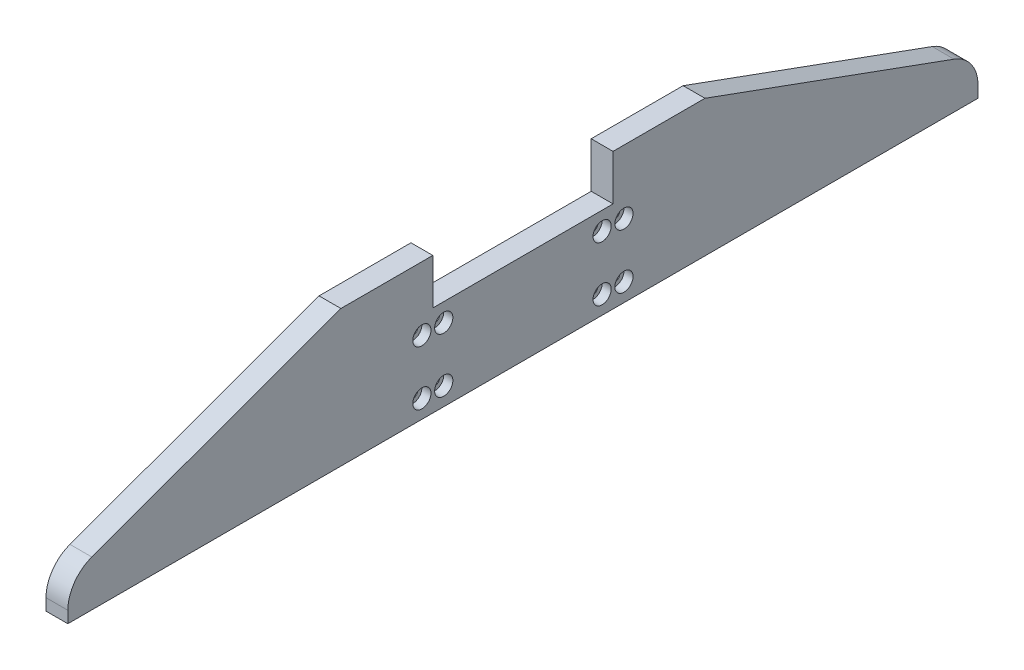
ISO-10303-21;
HEADER;
FILE_DESCRIPTION(('STEP AP214'),'2;1');
FILE_NAME('part.step','',(''),(''),'','','');
FILE_SCHEMA(('AUTOMOTIVE_DESIGN { 1 0 10303 214 1 1 1 1 }'));
ENDSEC;
DATA;
#1=APPLICATION_CONTEXT('core data for automotive mechanical design processes');
#2=APPLICATION_PROTOCOL_DEFINITION('international standard','automotive_design',2000,#1);
#3=PRODUCT_CONTEXT('',#1,'mechanical');
#4=PRODUCT('Part','Part','',(#3));
#5=PRODUCT_RELATED_PRODUCT_CATEGORY('part','',(#4));
#6=PRODUCT_DEFINITION_FORMATION('','',#4);
#7=PRODUCT_DEFINITION_CONTEXT('part definition',#1,'design');
#8=PRODUCT_DEFINITION('design','',#6,#7);
#9=PRODUCT_DEFINITION_SHAPE('','',#8);
#10=(LENGTH_UNIT() NAMED_UNIT(*) SI_UNIT(.MILLI.,.METRE.));
#11=(NAMED_UNIT(*) PLANE_ANGLE_UNIT() SI_UNIT($,.RADIAN.));
#12=(NAMED_UNIT(*) SI_UNIT($,.STERADIAN.) SOLID_ANGLE_UNIT());
#13=UNCERTAINTY_MEASURE_WITH_UNIT(LENGTH_MEASURE(1.E-05),#10,'distance_accuracy_value','');
#14=(GEOMETRIC_REPRESENTATION_CONTEXT(3) GLOBAL_UNCERTAINTY_ASSIGNED_CONTEXT((#13)) GLOBAL_UNIT_ASSIGNED_CONTEXT((#10,
#11,#12)) REPRESENTATION_CONTEXT('',''));
#15=CARTESIAN_POINT('',(0.,0.,0.));
#16=DIRECTION('',(0.,0.,1.));
#17=DIRECTION('',(1.,0.,0.));
#18=AXIS2_PLACEMENT_3D('',#15,#16,#17);
#19=CARTESIAN_POINT('',(12.,0.,500.));
#20=DIRECTION('',(-1.,0.,0.));
#21=DIRECTION('',(0.,-1.,0.));
#22=AXIS2_PLACEMENT_3D('',#19,#20,#21);
#23=PLANE('',#22);
#24=CARTESIAN_POINT('',(12.,40.,194.5));
#25=DIRECTION('',(1.,0.,0.));
#26=DIRECTION('',(0.,0.,-1.));
#27=AXIS2_PLACEMENT_3D('',#24,#25,#26);
#28=CIRCLE('',#27,5.);
#29=CARTESIAN_POINT('',(12.,40.,189.5));
#30=VERTEX_POINT('',#29);
#31=EDGE_CURVE('E559',#30,#30,#28,.T.);
#32=ORIENTED_EDGE('',*,*,#31,.F.);
#33=EDGE_LOOP('',(#32));
#34=FACE_BOUND('',#33,.T.);
#35=CARTESIAN_POINT('',(12.,40.,305.5));
#36=DIRECTION('',(1.,0.,0.));
#37=DIRECTION('',(0.,0.,-1.));
#38=AXIS2_PLACEMENT_3D('',#35,#36,#37);
#39=CIRCLE('',#38,5.);
#40=CARTESIAN_POINT('',(12.,40.,300.5));
#41=VERTEX_POINT('',#40);
#42=EDGE_CURVE('E581',#41,#41,#39,.T.);
#43=ORIENTED_EDGE('',*,*,#42,.F.);
#44=EDGE_LOOP('',(#43));
#45=FACE_BOUND('',#44,.T.);
#46=CARTESIAN_POINT('',(12.,9.99999999999999,305.5));
#47=DIRECTION('',(1.,0.,0.));
#48=DIRECTION('',(0.,0.,-1.));
#49=AXIS2_PLACEMENT_3D('',#46,#47,#48);
#50=CIRCLE('',#49,5.);
#51=CARTESIAN_POINT('',(12.,9.99999999999999,300.5));
#52=VERTEX_POINT('',#51);
#53=EDGE_CURVE('E593',#52,#52,#50,.T.);
#54=ORIENTED_EDGE('',*,*,#53,.F.);
#55=EDGE_LOOP('',(#54));
#56=FACE_BOUND('',#55,.T.);
#57=CARTESIAN_POINT('',(12.,40.,293.5));
#58=DIRECTION('',(1.,0.,0.));
#59=DIRECTION('',(0.,0.,-1.));
#60=AXIS2_PLACEMENT_3D('',#57,#58,#59);
#61=CIRCLE('',#60,5.);
#62=CARTESIAN_POINT('',(12.,40.,288.5));
#63=VERTEX_POINT('',#62);
#64=EDGE_CURVE('E605',#63,#63,#61,.T.);
#65=ORIENTED_EDGE('',*,*,#64,.F.);
#66=EDGE_LOOP('',(#65));
#67=FACE_BOUND('',#66,.T.);
#68=CARTESIAN_POINT('',(12.,9.99999999999999,206.5));
#69=DIRECTION('',(1.,0.,0.));
#70=DIRECTION('',(0.,0.,-1.));
#71=AXIS2_PLACEMENT_3D('',#68,#69,#70);
#72=CIRCLE('',#71,5.);
#73=CARTESIAN_POINT('',(12.,9.99999999999999,201.5));
#74=VERTEX_POINT('',#73);
#75=EDGE_CURVE('E617',#74,#74,#72,.T.);
#76=ORIENTED_EDGE('',*,*,#75,.F.);
#77=EDGE_LOOP('',(#76));
#78=FACE_BOUND('',#77,.T.);
#79=CARTESIAN_POINT('',(12.,9.99999999999999,293.5));
#80=DIRECTION('',(1.,0.,0.));
#81=DIRECTION('',(0.,0.,-1.));
#82=AXIS2_PLACEMENT_3D('',#79,#80,#81);
#83=CIRCLE('',#82,5.);
#84=CARTESIAN_POINT('',(12.,9.99999999999999,288.5));
#85=VERTEX_POINT('',#84);
#86=EDGE_CURVE('E629',#85,#85,#83,.T.);
#87=ORIENTED_EDGE('',*,*,#86,.F.);
#88=EDGE_LOOP('',(#87));
#89=FACE_BOUND('',#88,.T.);
#90=CARTESIAN_POINT('',(12.,40.,206.5));
#91=DIRECTION('',(1.,0.,0.));
#92=DIRECTION('',(0.,0.,-1.));
#93=AXIS2_PLACEMENT_3D('',#90,#91,#92);
#94=CIRCLE('',#93,5.);
#95=CARTESIAN_POINT('',(12.,40.,201.5));
#96=VERTEX_POINT('',#95);
#97=EDGE_CURVE('E641',#96,#96,#94,.T.);
#98=ORIENTED_EDGE('',*,*,#97,.F.);
#99=EDGE_LOOP('',(#98));
#100=FACE_BOUND('',#99,.T.);
#101=DIRECTION('',(0.,0.342020143325666,-0.939692620785909));
#102=VECTOR('',#101,1.);
#103=CARTESIAN_POINT('',(12.,20.4044648600696,500.));
#104=LINE('',#103,#102);
#105=CARTESIAN_POINT('',(12.,75.,349.999999999999));
#106=VERTEX_POINT('',#105);
#107=CARTESIAN_POINT('',(12.,25.1941665115935,486.840402866513));
#108=VERTEX_POINT('',#107);
#109=EDGE_CURVE('E199',#106,#108,#104,.F.);
#110=ORIENTED_EDGE('',*,*,#109,.T.);
#111=CARTESIAN_POINT('',(12.,6.40031409587534,480.));
#112=DIRECTION('',(-1.,0.,0.));
#113=DIRECTION('',(0.,-1.,0.));
#114=AXIS2_PLACEMENT_3D('',#111,#112,#113);
#115=CIRCLE('',#114,20.);
#116=CARTESIAN_POINT('',(12.,6.40031409587534,500.));
#117=VERTEX_POINT('',#116);
#118=EDGE_CURVE('E211',#108,#117,#115,.F.);
#119=ORIENTED_EDGE('',*,*,#118,.T.);
#120=DIRECTION('',(0.,1.,0.));
#121=VECTOR('',#120,1.);
#122=CARTESIAN_POINT('',(12.,0.,500.));
#123=LINE('',#122,#121);
#124=CARTESIAN_POINT('',(12.,0.,500.));
#125=VERTEX_POINT('',#124);
#126=EDGE_CURVE('E169',#125,#117,#123,.T.);
#127=ORIENTED_EDGE('',*,*,#126,.F.);
#128=DIRECTION('',(0.,0.,-1.));
#129=VECTOR('',#128,1.);
#130=CARTESIAN_POINT('',(12.,0.,500.));
#131=LINE('',#130,#129);
#132=CARTESIAN_POINT('',(12.,0.,0.));
#133=VERTEX_POINT('',#132);
#134=EDGE_CURVE('E181',#125,#133,#131,.T.);
#135=ORIENTED_EDGE('',*,*,#134,.T.);
#136=DIRECTION('',(0.,1.,0.));
#137=VECTOR('',#136,1.);
#138=CARTESIAN_POINT('',(12.,0.,0.));
#139=LINE('',#138,#137);
#140=CARTESIAN_POINT('',(12.,6.40031409587533,0.));
#141=VERTEX_POINT('',#140);
#142=EDGE_CURVE('E167',#133,#141,#139,.T.);
#143=ORIENTED_EDGE('',*,*,#142,.T.);
#144=CARTESIAN_POINT('',(12.,6.40031409587533,20.));
#145=DIRECTION('',(-1.,0.,0.));
#146=DIRECTION('',(0.,-1.,0.));
#147=AXIS2_PLACEMENT_3D('',#144,#145,#146);
#148=CIRCLE('',#147,20.);
#149=CARTESIAN_POINT('',(12.,25.1941665115935,13.1595971334867));
#150=VERTEX_POINT('',#149);
#151=EDGE_CURVE('E48',#141,#150,#148,.F.);
#152=ORIENTED_EDGE('',*,*,#151,.T.);
#153=DIRECTION('',(0.,0.342020143325666,0.939692620785909));
#154=VECTOR('',#153,1.);
#155=CARTESIAN_POINT('',(12.,75.,150.000000000001));
#156=LINE('',#155,#154);
#157=CARTESIAN_POINT('',(12.,75.,150.000000000001));
#158=VERTEX_POINT('',#157);
#159=EDGE_CURVE('E193',#150,#158,#156,.T.);
#160=ORIENTED_EDGE('',*,*,#159,.T.);
#161=DIRECTION('',(0.,0.,-1.));
#162=VECTOR('',#161,1.);
#163=CARTESIAN_POINT('',(12.,75.,500.));
#164=LINE('',#163,#162);
#165=CARTESIAN_POINT('',(12.,75.,200.5));
#166=VERTEX_POINT('',#165);
#167=EDGE_CURVE('E144',#166,#158,#164,.T.);
#168=ORIENTED_EDGE('',*,*,#167,.F.);
#169=DIRECTION('',(0.,-1.,0.));
#170=VECTOR('',#169,1.);
#171=CARTESIAN_POINT('',(12.,75.,200.5));
#172=LINE('',#171,#170);
#173=CARTESIAN_POINT('',(12.,50.,200.5));
#174=VERTEX_POINT('',#173);
#175=EDGE_CURVE('E124',#166,#174,#172,.T.);
#176=ORIENTED_EDGE('',*,*,#175,.T.);
#177=DIRECTION('',(0.,0.,1.));
#178=VECTOR('',#177,1.);
#179=CARTESIAN_POINT('',(12.,50.,200.5));
#180=LINE('',#179,#178);
#181=CARTESIAN_POINT('',(12.,50.,299.5));
#182=VERTEX_POINT('',#181);
#183=EDGE_CURVE('E135',#174,#182,#180,.T.);
#184=ORIENTED_EDGE('',*,*,#183,.T.);
#185=DIRECTION('',(0.,1.,0.));
#186=VECTOR('',#185,1.);
#187=CARTESIAN_POINT('',(12.,75.,299.5));
#188=LINE('',#187,#186);
#189=CARTESIAN_POINT('',(12.,75.,299.5));
#190=VERTEX_POINT('',#189);
#191=EDGE_CURVE('E132',#182,#190,#188,.T.);
#192=ORIENTED_EDGE('',*,*,#191,.T.);
#193=EDGE_CURVE('E179',#106,#190,#164,.T.);
#194=ORIENTED_EDGE('',*,*,#193,.F.);
#195=EDGE_LOOP('',(#110,#119,#127,#135,#143,#152,#160,#168,#176,#184,#192,#194));
#196=FACE_BOUND('',#195,.T.);
#197=CARTESIAN_POINT('',(12.,9.99999999999999,194.5));
#198=DIRECTION('',(1.,0.,0.));
#199=DIRECTION('',(0.,0.,-1.));
#200=AXIS2_PLACEMENT_3D('',#197,#198,#199);
#201=CIRCLE('',#200,5.);
#202=CARTESIAN_POINT('',(12.,9.99999999999999,189.5));
#203=VERTEX_POINT('',#202);
#204=EDGE_CURVE('E569',#203,#203,#201,.T.);
#205=ORIENTED_EDGE('',*,*,#204,.F.);
#206=EDGE_LOOP('',(#205));
#207=FACE_BOUND('',#206,.T.);
#208=ADVANCED_FACE('F33',(#34,#45,#56,#67,#78,#89,#100,#196,#207),#23,.F.);
#209=CARTESIAN_POINT('',(0.,75.,500.));
#210=DIRECTION('',(0.,-1.,0.));
#211=DIRECTION('',(0.,0.,-1.));
#212=AXIS2_PLACEMENT_3D('',#209,#210,#211);
#213=PLANE('',#212);
#214=ORIENTED_EDGE('',*,*,#167,.T.);
#215=DIRECTION('',(-1.,0.,0.));
#216=VECTOR('',#215,1.);
#217=CARTESIAN_POINT('',(0.,75.,150.000000000001));
#218=LINE('',#217,#216);
#219=CARTESIAN_POINT('',(0.,75.,150.000000000001));
#220=VERTEX_POINT('',#219);
#221=EDGE_CURVE('E187',#158,#220,#218,.T.);
#222=ORIENTED_EDGE('',*,*,#221,.T.);
#223=DIRECTION('',(0.,0.,-1.));
#224=VECTOR('',#223,1.);
#225=CARTESIAN_POINT('',(0.,75.,500.));
#226=LINE('',#225,#224);
#227=CARTESIAN_POINT('',(0.,75.,200.5));
#228=VERTEX_POINT('',#227);
#229=EDGE_CURVE('E172',#228,#220,#226,.T.);
#230=ORIENTED_EDGE('',*,*,#229,.F.);
#231=DIRECTION('',(-1.,0.,0.));
#232=VECTOR('',#231,1.);
#233=CARTESIAN_POINT('',(12.,75.,200.5));
#234=LINE('',#233,#232);
#235=EDGE_CURVE('E157',#166,#228,#234,.T.);
#236=ORIENTED_EDGE('',*,*,#235,.F.);
#237=EDGE_LOOP('',(#214,#222,#230,#236));
#238=FACE_BOUND('',#237,.T.);
#239=ADVANCED_FACE('F232',(#238),#213,.F.);
#240=CARTESIAN_POINT('',(0.,0.,500.));
#241=DIRECTION('',(1.,0.,0.));
#242=DIRECTION('',(0.,1.,0.));
#243=AXIS2_PLACEMENT_3D('',#240,#241,#242);
#244=PLANE('',#243);
#245=CARTESIAN_POINT('',(0.,40.,194.5));
#246=DIRECTION('',(1.,0.,0.));
#247=DIRECTION('',(0.,0.,-1.));
#248=AXIS2_PLACEMENT_3D('',#245,#246,#247);
#249=CIRCLE('',#248,2.75);
#250=CARTESIAN_POINT('',(0.,40.,191.75));
#251=VERTEX_POINT('',#250);
#252=EDGE_CURVE('E566',#251,#251,#249,.T.);
#253=ORIENTED_EDGE('',*,*,#252,.T.);
#254=EDGE_LOOP('',(#253));
#255=FACE_BOUND('',#254,.T.);
#256=CARTESIAN_POINT('',(0.,9.99999999999999,194.5));
#257=DIRECTION('',(1.,0.,0.));
#258=DIRECTION('',(0.,0.,-1.));
#259=AXIS2_PLACEMENT_3D('',#256,#257,#258);
#260=CIRCLE('',#259,2.75);
#261=CARTESIAN_POINT('',(0.,9.99999999999999,191.75));
#262=VERTEX_POINT('',#261);
#263=EDGE_CURVE('E578',#262,#262,#260,.T.);
#264=ORIENTED_EDGE('',*,*,#263,.T.);
#265=EDGE_LOOP('',(#264));
#266=FACE_BOUND('',#265,.T.);
#267=CARTESIAN_POINT('',(0.,40.,305.5));
#268=DIRECTION('',(1.,0.,0.));
#269=DIRECTION('',(0.,0.,-1.));
#270=AXIS2_PLACEMENT_3D('',#267,#268,#269);
#271=CIRCLE('',#270,2.75);
#272=CARTESIAN_POINT('',(0.,40.,302.75));
#273=VERTEX_POINT('',#272);
#274=EDGE_CURVE('E590',#273,#273,#271,.T.);
#275=ORIENTED_EDGE('',*,*,#274,.T.);
#276=EDGE_LOOP('',(#275));
#277=FACE_BOUND('',#276,.T.);
#278=CARTESIAN_POINT('',(0.,9.99999999999999,305.5));
#279=DIRECTION('',(1.,0.,0.));
#280=DIRECTION('',(0.,0.,-1.));
#281=AXIS2_PLACEMENT_3D('',#278,#279,#280);
#282=CIRCLE('',#281,2.75);
#283=CARTESIAN_POINT('',(0.,9.99999999999999,302.75));
#284=VERTEX_POINT('',#283);
#285=EDGE_CURVE('E602',#284,#284,#282,.T.);
#286=ORIENTED_EDGE('',*,*,#285,.T.);
#287=EDGE_LOOP('',(#286));
#288=FACE_BOUND('',#287,.T.);
#289=CARTESIAN_POINT('',(0.,40.,293.5));
#290=DIRECTION('',(1.,0.,0.));
#291=DIRECTION('',(0.,0.,-1.));
#292=AXIS2_PLACEMENT_3D('',#289,#290,#291);
#293=CIRCLE('',#292,2.75);
#294=CARTESIAN_POINT('',(0.,40.,290.75));
#295=VERTEX_POINT('',#294);
#296=EDGE_CURVE('E614',#295,#295,#293,.T.);
#297=ORIENTED_EDGE('',*,*,#296,.T.);
#298=EDGE_LOOP('',(#297));
#299=FACE_BOUND('',#298,.T.);
#300=CARTESIAN_POINT('',(0.,9.99999999999999,206.5));
#301=DIRECTION('',(1.,0.,0.));
#302=DIRECTION('',(0.,0.,-1.));
#303=AXIS2_PLACEMENT_3D('',#300,#301,#302);
#304=CIRCLE('',#303,2.75);
#305=CARTESIAN_POINT('',(0.,9.99999999999999,203.75));
#306=VERTEX_POINT('',#305);
#307=EDGE_CURVE('E626',#306,#306,#304,.T.);
#308=ORIENTED_EDGE('',*,*,#307,.T.);
#309=EDGE_LOOP('',(#308));
#310=FACE_BOUND('',#309,.T.);
#311=CARTESIAN_POINT('',(0.,9.99999999999999,293.5));
#312=DIRECTION('',(1.,0.,0.));
#313=DIRECTION('',(0.,0.,-1.));
#314=AXIS2_PLACEMENT_3D('',#311,#312,#313);
#315=CIRCLE('',#314,2.75);
#316=CARTESIAN_POINT('',(0.,9.99999999999999,290.75));
#317=VERTEX_POINT('',#316);
#318=EDGE_CURVE('E638',#317,#317,#315,.T.);
#319=ORIENTED_EDGE('',*,*,#318,.T.);
#320=EDGE_LOOP('',(#319));
#321=FACE_BOUND('',#320,.T.);
#322=CARTESIAN_POINT('',(0.,40.,206.5));
#323=DIRECTION('',(1.,0.,0.));
#324=DIRECTION('',(0.,0.,-1.));
#325=AXIS2_PLACEMENT_3D('',#322,#323,#324);
#326=CIRCLE('',#325,2.75);
#327=CARTESIAN_POINT('',(0.,40.,203.75));
#328=VERTEX_POINT('',#327);
#329=EDGE_CURVE('E151',#328,#328,#326,.T.);
#330=ORIENTED_EDGE('',*,*,#329,.T.);
#331=EDGE_LOOP('',(#330));
#332=FACE_BOUND('',#331,.T.);
#333=DIRECTION('',(0.,-1.,0.));
#334=VECTOR('',#333,1.);
#335=CARTESIAN_POINT('',(0.,0.,500.));
#336=LINE('',#335,#334);
#337=CARTESIAN_POINT('',(0.,6.40031409587534,500.));
#338=VERTEX_POINT('',#337);
#339=CARTESIAN_POINT('',(0.,0.,500.));
#340=VERTEX_POINT('',#339);
#341=EDGE_CURVE('E164',#338,#340,#336,.T.);
#342=ORIENTED_EDGE('',*,*,#341,.F.);
#343=CARTESIAN_POINT('',(0.,6.40031409587534,480.));
#344=DIRECTION('',(1.,0.,0.));
#345=DIRECTION('',(0.,1.,0.));
#346=AXIS2_PLACEMENT_3D('',#343,#344,#345);
#347=CIRCLE('',#346,20.);
#348=CARTESIAN_POINT('',(0.,25.1941665115935,486.840402866513));
#349=VERTEX_POINT('',#348);
#350=EDGE_CURVE('E206',#338,#349,#347,.F.);
#351=ORIENTED_EDGE('',*,*,#350,.T.);
#352=DIRECTION('',(0.,-0.342020143325666,0.939692620785909));
#353=VECTOR('',#352,1.);
#354=CARTESIAN_POINT('',(0.,20.4044648600696,500.));
#355=LINE('',#354,#353);
#356=CARTESIAN_POINT('',(0.,75.,349.999999999999));
#357=VERTEX_POINT('',#356);
#358=EDGE_CURVE('E195',#349,#357,#355,.F.);
#359=ORIENTED_EDGE('',*,*,#358,.T.);
#360=CARTESIAN_POINT('',(0.,75.,299.5));
#361=VERTEX_POINT('',#360);
#362=EDGE_CURVE('E177',#357,#361,#226,.T.);
#363=ORIENTED_EDGE('',*,*,#362,.T.);
#364=DIRECTION('',(0.,1.,0.));
#365=VECTOR('',#364,1.);
#366=CARTESIAN_POINT('',(0.,75.,299.5));
#367=LINE('',#366,#365);
#368=CARTESIAN_POINT('',(0.,50.,299.5));
#369=VERTEX_POINT('',#368);
#370=EDGE_CURVE('E145',#369,#361,#367,.T.);
#371=ORIENTED_EDGE('',*,*,#370,.F.);
#372=DIRECTION('',(0.,0.,1.));
#373=VECTOR('',#372,1.);
#374=CARTESIAN_POINT('',(0.,50.,200.5));
#375=LINE('',#374,#373);
#376=CARTESIAN_POINT('',(0.,50.,200.5));
#377=VERTEX_POINT('',#376);
#378=EDGE_CURVE('E148',#377,#369,#375,.T.);
#379=ORIENTED_EDGE('',*,*,#378,.F.);
#380=DIRECTION('',(0.,-1.,0.));
#381=VECTOR('',#380,1.);
#382=CARTESIAN_POINT('',(0.,75.,200.5));
#383=LINE('',#382,#381);
#384=EDGE_CURVE('E127',#228,#377,#383,.T.);
#385=ORIENTED_EDGE('',*,*,#384,.F.);
#386=ORIENTED_EDGE('',*,*,#229,.T.);
#387=DIRECTION('',(0.,-0.342020143325666,-0.939692620785909));
#388=VECTOR('',#387,1.);
#389=CARTESIAN_POINT('',(0.,75.,150.000000000001));
#390=LINE('',#389,#388);
#391=CARTESIAN_POINT('',(0.,25.1941665115935,13.1595971334867));
#392=VERTEX_POINT('',#391);
#393=EDGE_CURVE('E190',#220,#392,#390,.T.);
#394=ORIENTED_EDGE('',*,*,#393,.T.);
#395=CARTESIAN_POINT('',(0.,6.40031409587533,20.));
#396=DIRECTION('',(1.,0.,0.));
#397=DIRECTION('',(0.,1.,0.));
#398=AXIS2_PLACEMENT_3D('',#395,#396,#397);
#399=CIRCLE('',#398,20.);
#400=CARTESIAN_POINT('',(0.,6.40031409587533,0.));
#401=VERTEX_POINT('',#400);
#402=EDGE_CURVE('E204',#392,#401,#399,.F.);
#403=ORIENTED_EDGE('',*,*,#402,.T.);
#404=DIRECTION('',(0.,-1.,0.));
#405=VECTOR('',#404,1.);
#406=CARTESIAN_POINT('',(0.,0.,0.));
#407=LINE('',#406,#405);
#408=CARTESIAN_POINT('',(0.,0.,0.));
#409=VERTEX_POINT('',#408);
#410=EDGE_CURVE('E159',#401,#409,#407,.T.);
#411=ORIENTED_EDGE('',*,*,#410,.T.);
#412=DIRECTION('',(0.,0.,-1.));
#413=VECTOR('',#412,1.);
#414=CARTESIAN_POINT('',(0.,0.,500.));
#415=LINE('',#414,#413);
#416=EDGE_CURVE('E184',#340,#409,#415,.T.);
#417=ORIENTED_EDGE('',*,*,#416,.F.);
#418=EDGE_LOOP('',(#342,#351,#359,#363,#371,#379,#385,#386,#394,#403,#411,#417));
#419=FACE_BOUND('',#418,.T.);
#420=ADVANCED_FACE('F226',(#255,#266,#277,#288,#299,#310,#321,#332,#419),#244,.F.);
#421=CARTESIAN_POINT('',(0.,0.,500.));
#422=DIRECTION('',(0.,1.,0.));
#423=DIRECTION('',(0.,0.,1.));
#424=AXIS2_PLACEMENT_3D('',#421,#422,#423);
#425=PLANE('',#424);
#426=DIRECTION('',(1.,0.,0.));
#427=VECTOR('',#426,1.);
#428=CARTESIAN_POINT('',(0.,0.,0.));
#429=LINE('',#428,#427);
#430=EDGE_CURVE('E174',#409,#133,#429,.T.);
#431=ORIENTED_EDGE('',*,*,#430,.T.);
#432=ORIENTED_EDGE('',*,*,#134,.F.);
#433=DIRECTION('',(1.,0.,0.));
#434=VECTOR('',#433,1.);
#435=CARTESIAN_POINT('',(0.,0.,500.));
#436=LINE('',#435,#434);
#437=EDGE_CURVE('E166',#340,#125,#436,.T.);
#438=ORIENTED_EDGE('',*,*,#437,.F.);
#439=ORIENTED_EDGE('',*,*,#416,.T.);
#440=EDGE_LOOP('',(#431,#432,#438,#439));
#441=FACE_BOUND('',#440,.T.);
#442=ADVANCED_FACE('F222',(#441),#425,.F.);
#443=ORIENTED_EDGE('',*,*,#362,.F.);
#444=DIRECTION('',(1.,0.,0.));
#445=VECTOR('',#444,1.);
#446=CARTESIAN_POINT('',(0.,75.,349.999999999999));
#447=LINE('',#446,#445);
#448=EDGE_CURVE('E197',#357,#106,#447,.T.);
#449=ORIENTED_EDGE('',*,*,#448,.T.);
#450=ORIENTED_EDGE('',*,*,#193,.T.);
#451=DIRECTION('',(-1.,0.,0.));
#452=VECTOR('',#451,1.);
#453=CARTESIAN_POINT('',(12.,75.,299.5));
#454=LINE('',#453,#452);
#455=EDGE_CURVE('E160',#190,#361,#454,.T.);
#456=ORIENTED_EDGE('',*,*,#455,.T.);
#457=EDGE_LOOP('',(#443,#449,#450,#456));
#458=FACE_BOUND('',#457,.T.);
#459=ADVANCED_FACE('F240',(#458),#213,.F.);
#460=CARTESIAN_POINT('',(0.,0.,500.));
#461=DIRECTION('',(0.,0.,-1.));
#462=DIRECTION('',(-1.,0.,0.));
#463=AXIS2_PLACEMENT_3D('',#460,#461,#462);
#464=PLANE('',#463);
#465=ORIENTED_EDGE('',*,*,#126,.T.);
#466=DIRECTION('',(1.,0.,0.));
#467=VECTOR('',#466,1.);
#468=CARTESIAN_POINT('',(0.,6.40031409587534,500.));
#469=LINE('',#468,#467);
#470=EDGE_CURVE('E201',#117,#338,#469,.F.);
#471=ORIENTED_EDGE('',*,*,#470,.T.);
#472=ORIENTED_EDGE('',*,*,#341,.T.);
#473=ORIENTED_EDGE('',*,*,#437,.T.);
#474=EDGE_LOOP('',(#465,#471,#472,#473));
#475=FACE_BOUND('',#474,.T.);
#476=ADVANCED_FACE('F253',(#475),#464,.F.);
#477=CARTESIAN_POINT('',(0.,0.,0.));
#478=DIRECTION('',(0.,0.,-1.));
#479=DIRECTION('',(-1.,0.,0.));
#480=AXIS2_PLACEMENT_3D('',#477,#478,#479);
#481=PLANE('',#480);
#482=ORIENTED_EDGE('',*,*,#410,.F.);
#483=DIRECTION('',(1.,0.,0.));
#484=VECTOR('',#483,1.);
#485=CARTESIAN_POINT('',(0.,6.40031409587533,0.));
#486=LINE('',#485,#484);
#487=EDGE_CURVE('E41',#401,#141,#486,.T.);
#488=ORIENTED_EDGE('',*,*,#487,.T.);
#489=ORIENTED_EDGE('',*,*,#142,.F.);
#490=ORIENTED_EDGE('',*,*,#430,.F.);
#491=EDGE_LOOP('',(#482,#488,#489,#490));
#492=FACE_BOUND('',#491,.T.);
#493=ADVANCED_FACE('F215',(#492),#481,.T.);
#494=CARTESIAN_POINT('',(12.,75.,200.5));
#495=DIRECTION('',(0.,0.,-1.));
#496=DIRECTION('',(-1.,0.,0.));
#497=AXIS2_PLACEMENT_3D('',#494,#495,#496);
#498=PLANE('',#497);
#499=ORIENTED_EDGE('',*,*,#384,.T.);
#500=DIRECTION('',(-1.,0.,0.));
#501=VECTOR('',#500,1.);
#502=CARTESIAN_POINT('',(12.,50.,200.5));
#503=LINE('',#502,#501);
#504=EDGE_CURVE('E120',#174,#377,#503,.T.);
#505=ORIENTED_EDGE('',*,*,#504,.F.);
#506=ORIENTED_EDGE('',*,*,#175,.F.);
#507=ORIENTED_EDGE('',*,*,#235,.T.);
#508=EDGE_LOOP('',(#499,#505,#506,#507));
#509=FACE_BOUND('',#508,.T.);
#510=ADVANCED_FACE('F122',(#509),#498,.F.);
#511=CARTESIAN_POINT('',(12.,75.,299.5));
#512=DIRECTION('',(0.,0.,1.));
#513=DIRECTION('',(1.,0.,0.));
#514=AXIS2_PLACEMENT_3D('',#511,#512,#513);
#515=PLANE('',#514);
#516=ORIENTED_EDGE('',*,*,#370,.T.);
#517=ORIENTED_EDGE('',*,*,#455,.F.);
#518=ORIENTED_EDGE('',*,*,#191,.F.);
#519=DIRECTION('',(-1.,0.,0.));
#520=VECTOR('',#519,1.);
#521=CARTESIAN_POINT('',(12.,50.,299.5));
#522=LINE('',#521,#520);
#523=EDGE_CURVE('E131',#182,#369,#522,.T.);
#524=ORIENTED_EDGE('',*,*,#523,.T.);
#525=EDGE_LOOP('',(#516,#517,#518,#524));
#526=FACE_BOUND('',#525,.T.);
#527=ADVANCED_FACE('F238',(#526),#515,.F.);
#528=CARTESIAN_POINT('',(12.,50.,200.5));
#529=DIRECTION('',(0.,-1.,0.));
#530=DIRECTION('',(0.,0.,-1.));
#531=AXIS2_PLACEMENT_3D('',#528,#529,#530);
#532=PLANE('',#531);
#533=ORIENTED_EDGE('',*,*,#378,.T.);
#534=ORIENTED_EDGE('',*,*,#523,.F.);
#535=ORIENTED_EDGE('',*,*,#183,.F.);
#536=ORIENTED_EDGE('',*,*,#504,.T.);
#537=EDGE_LOOP('',(#533,#534,#535,#536));
#538=FACE_BOUND('',#537,.T.);
#539=ADVANCED_FACE('F136',(#538),#532,.F.);
#540=CARTESIAN_POINT('',(12.,40.,206.5));
#541=DIRECTION('',(1.,0.,0.));
#542=DIRECTION('',(0.,0.,-1.));
#543=AXIS2_PLACEMENT_3D('',#540,#541,#542);
#544=CYLINDRICAL_SURFACE('',#543,2.75);
#545=ORIENTED_EDGE('',*,*,#329,.F.);
#546=EDGE_LOOP('',(#545));
#547=FACE_BOUND('',#546,.T.);
#548=CARTESIAN_POINT('',(7.,40.,206.5));
#549=DIRECTION('',(1.,0.,0.));
#550=DIRECTION('',(0.,0.,-1.));
#551=AXIS2_PLACEMENT_3D('',#548,#549,#550);
#552=CIRCLE('',#551,2.75);
#553=CARTESIAN_POINT('',(7.,40.,203.75));
#554=VERTEX_POINT('',#553);
#555=EDGE_CURVE('E646',#554,#554,#552,.T.);
#556=ORIENTED_EDGE('',*,*,#555,.T.);
#557=EDGE_LOOP('',(#556));
#558=FACE_BOUND('',#557,.T.);
#559=ADVANCED_FACE('F344',(#547,#558),#544,.F.);
#560=CARTESIAN_POINT('',(7.,42.75,206.5));
#561=DIRECTION('',(-1.,0.,0.));
#562=DIRECTION('',(0.,0.,1.));
#563=AXIS2_PLACEMENT_3D('',#560,#561,#562);
#564=PLANE('',#563);
#565=ORIENTED_EDGE('',*,*,#555,.F.);
#566=EDGE_LOOP('',(#565));
#567=FACE_BOUND('',#566,.T.);
#568=CARTESIAN_POINT('',(7.,40.,206.5));
#569=DIRECTION('',(1.,0.,0.));
#570=DIRECTION('',(0.,0.,-1.));
#571=AXIS2_PLACEMENT_3D('',#568,#569,#570);
#572=CIRCLE('',#571,5.);
#573=CARTESIAN_POINT('',(7.,40.,201.5));
#574=VERTEX_POINT('',#573);
#575=EDGE_CURVE('E644',#574,#574,#572,.T.);
#576=ORIENTED_EDGE('',*,*,#575,.T.);
#577=EDGE_LOOP('',(#576));
#578=FACE_BOUND('',#577,.T.);
#579=ADVANCED_FACE('F340',(#567,#578),#564,.F.);
#580=CARTESIAN_POINT('',(12.,40.,206.5));
#581=DIRECTION('',(1.,0.,0.));
#582=DIRECTION('',(0.,0.,-1.));
#583=AXIS2_PLACEMENT_3D('',#580,#581,#582);
#584=CYLINDRICAL_SURFACE('',#583,5.);
#585=ORIENTED_EDGE('',*,*,#575,.F.);
#586=EDGE_LOOP('',(#585));
#587=FACE_BOUND('',#586,.T.);
#588=ORIENTED_EDGE('',*,*,#97,.T.);
#589=EDGE_LOOP('',(#588));
#590=FACE_BOUND('',#589,.T.);
#591=ADVANCED_FACE('F336',(#587,#590),#584,.F.);
#592=CARTESIAN_POINT('',(12.,9.99999999999999,293.5));
#593=DIRECTION('',(1.,0.,0.));
#594=DIRECTION('',(0.,0.,-1.));
#595=AXIS2_PLACEMENT_3D('',#592,#593,#594);
#596=CYLINDRICAL_SURFACE('',#595,2.75);
#597=ORIENTED_EDGE('',*,*,#318,.F.);
#598=EDGE_LOOP('',(#597));
#599=FACE_BOUND('',#598,.T.);
#600=CARTESIAN_POINT('',(7.,9.99999999999999,293.5));
#601=DIRECTION('',(1.,0.,0.));
#602=DIRECTION('',(0.,0.,-1.));
#603=AXIS2_PLACEMENT_3D('',#600,#601,#602);
#604=CIRCLE('',#603,2.75);
#605=CARTESIAN_POINT('',(7.,9.99999999999999,290.75));
#606=VERTEX_POINT('',#605);
#607=EDGE_CURVE('E635',#606,#606,#604,.T.);
#608=ORIENTED_EDGE('',*,*,#607,.T.);
#609=EDGE_LOOP('',(#608));
#610=FACE_BOUND('',#609,.T.);
#611=ADVANCED_FACE('F332',(#599,#610),#596,.F.);
#612=CARTESIAN_POINT('',(7.,12.75,293.5));
#613=DIRECTION('',(-1.,0.,0.));
#614=DIRECTION('',(0.,0.,1.));
#615=AXIS2_PLACEMENT_3D('',#612,#613,#614);
#616=PLANE('',#615);
#617=ORIENTED_EDGE('',*,*,#607,.F.);
#618=EDGE_LOOP('',(#617));
#619=FACE_BOUND('',#618,.T.);
#620=CARTESIAN_POINT('',(7.,9.99999999999999,293.5));
#621=DIRECTION('',(1.,0.,0.));
#622=DIRECTION('',(0.,0.,-1.));
#623=AXIS2_PLACEMENT_3D('',#620,#621,#622);
#624=CIRCLE('',#623,5.);
#625=CARTESIAN_POINT('',(7.,9.99999999999999,288.5));
#626=VERTEX_POINT('',#625);
#627=EDGE_CURVE('E632',#626,#626,#624,.T.);
#628=ORIENTED_EDGE('',*,*,#627,.T.);
#629=EDGE_LOOP('',(#628));
#630=FACE_BOUND('',#629,.T.);
#631=ADVANCED_FACE('F328',(#619,#630),#616,.F.);
#632=CARTESIAN_POINT('',(12.,9.99999999999999,293.5));
#633=DIRECTION('',(1.,0.,0.));
#634=DIRECTION('',(0.,0.,-1.));
#635=AXIS2_PLACEMENT_3D('',#632,#633,#634);
#636=CYLINDRICAL_SURFACE('',#635,5.);
#637=ORIENTED_EDGE('',*,*,#627,.F.);
#638=EDGE_LOOP('',(#637));
#639=FACE_BOUND('',#638,.T.);
#640=ORIENTED_EDGE('',*,*,#86,.T.);
#641=EDGE_LOOP('',(#640));
#642=FACE_BOUND('',#641,.T.);
#643=ADVANCED_FACE('F324',(#639,#642),#636,.F.);
#644=CARTESIAN_POINT('',(12.,9.99999999999999,206.5));
#645=DIRECTION('',(1.,0.,0.));
#646=DIRECTION('',(0.,0.,-1.));
#647=AXIS2_PLACEMENT_3D('',#644,#645,#646);
#648=CYLINDRICAL_SURFACE('',#647,2.75);
#649=ORIENTED_EDGE('',*,*,#307,.F.);
#650=EDGE_LOOP('',(#649));
#651=FACE_BOUND('',#650,.T.);
#652=CARTESIAN_POINT('',(7.,9.99999999999999,206.5));
#653=DIRECTION('',(1.,0.,0.));
#654=DIRECTION('',(0.,0.,-1.));
#655=AXIS2_PLACEMENT_3D('',#652,#653,#654);
#656=CIRCLE('',#655,2.75);
#657=CARTESIAN_POINT('',(7.,9.99999999999999,203.75));
#658=VERTEX_POINT('',#657);
#659=EDGE_CURVE('E623',#658,#658,#656,.T.);
#660=ORIENTED_EDGE('',*,*,#659,.T.);
#661=EDGE_LOOP('',(#660));
#662=FACE_BOUND('',#661,.T.);
#663=ADVANCED_FACE('F320',(#651,#662),#648,.F.);
#664=CARTESIAN_POINT('',(7.,12.75,206.5));
#665=DIRECTION('',(-1.,0.,0.));
#666=DIRECTION('',(0.,0.,1.));
#667=AXIS2_PLACEMENT_3D('',#664,#665,#666);
#668=PLANE('',#667);
#669=ORIENTED_EDGE('',*,*,#659,.F.);
#670=EDGE_LOOP('',(#669));
#671=FACE_BOUND('',#670,.T.);
#672=CARTESIAN_POINT('',(7.,9.99999999999999,206.5));
#673=DIRECTION('',(1.,0.,0.));
#674=DIRECTION('',(0.,0.,-1.));
#675=AXIS2_PLACEMENT_3D('',#672,#673,#674);
#676=CIRCLE('',#675,5.);
#677=CARTESIAN_POINT('',(7.,9.99999999999999,201.5));
#678=VERTEX_POINT('',#677);
#679=EDGE_CURVE('E620',#678,#678,#676,.T.);
#680=ORIENTED_EDGE('',*,*,#679,.T.);
#681=EDGE_LOOP('',(#680));
#682=FACE_BOUND('',#681,.T.);
#683=ADVANCED_FACE('F316',(#671,#682),#668,.F.);
#684=CARTESIAN_POINT('',(12.,9.99999999999999,206.5));
#685=DIRECTION('',(1.,0.,0.));
#686=DIRECTION('',(0.,0.,-1.));
#687=AXIS2_PLACEMENT_3D('',#684,#685,#686);
#688=CYLINDRICAL_SURFACE('',#687,5.);
#689=ORIENTED_EDGE('',*,*,#679,.F.);
#690=EDGE_LOOP('',(#689));
#691=FACE_BOUND('',#690,.T.);
#692=ORIENTED_EDGE('',*,*,#75,.T.);
#693=EDGE_LOOP('',(#692));
#694=FACE_BOUND('',#693,.T.);
#695=ADVANCED_FACE('F312',(#691,#694),#688,.F.);
#696=CARTESIAN_POINT('',(12.,40.,293.5));
#697=DIRECTION('',(1.,0.,0.));
#698=DIRECTION('',(0.,0.,-1.));
#699=AXIS2_PLACEMENT_3D('',#696,#697,#698);
#700=CYLINDRICAL_SURFACE('',#699,2.75);
#701=ORIENTED_EDGE('',*,*,#296,.F.);
#702=EDGE_LOOP('',(#701));
#703=FACE_BOUND('',#702,.T.);
#704=CARTESIAN_POINT('',(7.,40.,293.5));
#705=DIRECTION('',(1.,0.,0.));
#706=DIRECTION('',(0.,0.,-1.));
#707=AXIS2_PLACEMENT_3D('',#704,#705,#706);
#708=CIRCLE('',#707,2.75);
#709=CARTESIAN_POINT('',(7.,40.,290.75));
#710=VERTEX_POINT('',#709);
#711=EDGE_CURVE('E611',#710,#710,#708,.T.);
#712=ORIENTED_EDGE('',*,*,#711,.T.);
#713=EDGE_LOOP('',(#712));
#714=FACE_BOUND('',#713,.T.);
#715=ADVANCED_FACE('F308',(#703,#714),#700,.F.);
#716=CARTESIAN_POINT('',(7.,42.75,293.5));
#717=DIRECTION('',(-1.,0.,0.));
#718=DIRECTION('',(0.,0.,1.));
#719=AXIS2_PLACEMENT_3D('',#716,#717,#718);
#720=PLANE('',#719);
#721=ORIENTED_EDGE('',*,*,#711,.F.);
#722=EDGE_LOOP('',(#721));
#723=FACE_BOUND('',#722,.T.);
#724=CARTESIAN_POINT('',(7.,40.,293.5));
#725=DIRECTION('',(1.,0.,0.));
#726=DIRECTION('',(0.,0.,-1.));
#727=AXIS2_PLACEMENT_3D('',#724,#725,#726);
#728=CIRCLE('',#727,5.);
#729=CARTESIAN_POINT('',(7.,40.,288.5));
#730=VERTEX_POINT('',#729);
#731=EDGE_CURVE('E608',#730,#730,#728,.T.);
#732=ORIENTED_EDGE('',*,*,#731,.T.);
#733=EDGE_LOOP('',(#732));
#734=FACE_BOUND('',#733,.T.);
#735=ADVANCED_FACE('F304',(#723,#734),#720,.F.);
#736=CARTESIAN_POINT('',(12.,40.,293.5));
#737=DIRECTION('',(1.,0.,0.));
#738=DIRECTION('',(0.,0.,-1.));
#739=AXIS2_PLACEMENT_3D('',#736,#737,#738);
#740=CYLINDRICAL_SURFACE('',#739,5.);
#741=ORIENTED_EDGE('',*,*,#731,.F.);
#742=EDGE_LOOP('',(#741));
#743=FACE_BOUND('',#742,.T.);
#744=ORIENTED_EDGE('',*,*,#64,.T.);
#745=EDGE_LOOP('',(#744));
#746=FACE_BOUND('',#745,.T.);
#747=ADVANCED_FACE('F279',(#743,#746),#740,.F.);
#748=CARTESIAN_POINT('',(0.,75.,150.000000000001));
#749=DIRECTION('',(0.,0.939692620785909,-0.342020143325666));
#750=DIRECTION('',(1.,0.,0.));
#751=AXIS2_PLACEMENT_3D('',#748,#749,#750);
#752=PLANE('',#751);
#753=ORIENTED_EDGE('',*,*,#159,.F.);
#754=DIRECTION('',(1.,0.,0.));
#755=VECTOR('',#754,1.);
#756=CARTESIAN_POINT('',(0.,25.1941665115935,13.1595971334867));
#757=LINE('',#756,#755);
#758=EDGE_CURVE('E11',#150,#392,#757,.F.);
#759=ORIENTED_EDGE('',*,*,#758,.T.);
#760=ORIENTED_EDGE('',*,*,#393,.F.);
#761=ORIENTED_EDGE('',*,*,#221,.F.);
#762=EDGE_LOOP('',(#753,#759,#760,#761));
#763=FACE_BOUND('',#762,.T.);
#764=ADVANCED_FACE('F229',(#763),#752,.T.);
#765=CARTESIAN_POINT('',(0.,20.4044648600696,500.));
#766=DIRECTION('',(0.,-0.939692620785909,-0.342020143325666));
#767=DIRECTION('',(-1.,0.,0.));
#768=AXIS2_PLACEMENT_3D('',#765,#766,#767);
#769=PLANE('',#768);
#770=ORIENTED_EDGE('',*,*,#358,.F.);
#771=DIRECTION('',(-1.,0.,0.));
#772=VECTOR('',#771,1.);
#773=CARTESIAN_POINT('',(12.,25.1941665115935,486.840402866513));
#774=LINE('',#773,#772);
#775=EDGE_CURVE('E208',#349,#108,#774,.F.);
#776=ORIENTED_EDGE('',*,*,#775,.T.);
#777=ORIENTED_EDGE('',*,*,#109,.F.);
#778=ORIENTED_EDGE('',*,*,#448,.F.);
#779=EDGE_LOOP('',(#770,#776,#777,#778));
#780=FACE_BOUND('',#779,.T.);
#781=ADVANCED_FACE('F247',(#780),#769,.F.);
#782=CARTESIAN_POINT('',(0.,6.40031409587534,480.));
#783=DIRECTION('',(-1.,0.,0.));
#784=DIRECTION('',(0.,0.,1.));
#785=AXIS2_PLACEMENT_3D('',#782,#783,#784);
#786=CYLINDRICAL_SURFACE('',#785,20.);
#787=ORIENTED_EDGE('',*,*,#118,.F.);
#788=ORIENTED_EDGE('',*,*,#775,.F.);
#789=ORIENTED_EDGE('',*,*,#350,.F.);
#790=ORIENTED_EDGE('',*,*,#470,.F.);
#791=EDGE_LOOP('',(#787,#788,#789,#790));
#792=FACE_BOUND('',#791,.T.);
#793=ADVANCED_FACE('F250',(#792),#786,.T.);
#794=CARTESIAN_POINT('',(0.,6.40031409587533,20.));
#795=DIRECTION('',(1.,0.,0.));
#796=DIRECTION('',(0.,0.,-1.));
#797=AXIS2_PLACEMENT_3D('',#794,#795,#796);
#798=CYLINDRICAL_SURFACE('',#797,20.);
#799=ORIENTED_EDGE('',*,*,#402,.F.);
#800=ORIENTED_EDGE('',*,*,#758,.F.);
#801=ORIENTED_EDGE('',*,*,#151,.F.);
#802=ORIENTED_EDGE('',*,*,#487,.F.);
#803=EDGE_LOOP('',(#799,#800,#801,#802));
#804=FACE_BOUND('',#803,.T.);
#805=ADVANCED_FACE('F35',(#804),#798,.T.);
#806=CARTESIAN_POINT('',(12.,9.99999999999999,305.5));
#807=DIRECTION('',(1.,0.,0.));
#808=DIRECTION('',(0.,0.,-1.));
#809=AXIS2_PLACEMENT_3D('',#806,#807,#808);
#810=CYLINDRICAL_SURFACE('',#809,2.75);
#811=ORIENTED_EDGE('',*,*,#285,.F.);
#812=EDGE_LOOP('',(#811));
#813=FACE_BOUND('',#812,.T.);
#814=CARTESIAN_POINT('',(7.,9.99999999999999,305.5));
#815=DIRECTION('',(1.,0.,0.));
#816=DIRECTION('',(0.,0.,-1.));
#817=AXIS2_PLACEMENT_3D('',#814,#815,#816);
#818=CIRCLE('',#817,2.75);
#819=CARTESIAN_POINT('',(7.,9.99999999999999,302.75));
#820=VERTEX_POINT('',#819);
#821=EDGE_CURVE('E599',#820,#820,#818,.T.);
#822=ORIENTED_EDGE('',*,*,#821,.T.);
#823=EDGE_LOOP('',(#822));
#824=FACE_BOUND('',#823,.T.);
#825=ADVANCED_FACE('F285',(#813,#824),#810,.F.);
#826=CARTESIAN_POINT('',(7.,12.75,305.5));
#827=DIRECTION('',(-1.,0.,0.));
#828=DIRECTION('',(0.,0.,1.));
#829=AXIS2_PLACEMENT_3D('',#826,#827,#828);
#830=PLANE('',#829);
#831=ORIENTED_EDGE('',*,*,#821,.F.);
#832=EDGE_LOOP('',(#831));
#833=FACE_BOUND('',#832,.T.);
#834=CARTESIAN_POINT('',(7.,9.99999999999999,305.5));
#835=DIRECTION('',(1.,0.,0.));
#836=DIRECTION('',(0.,0.,-1.));
#837=AXIS2_PLACEMENT_3D('',#834,#835,#836);
#838=CIRCLE('',#837,5.);
#839=CARTESIAN_POINT('',(7.,9.99999999999999,300.5));
#840=VERTEX_POINT('',#839);
#841=EDGE_CURVE('E596',#840,#840,#838,.T.);
#842=ORIENTED_EDGE('',*,*,#841,.T.);
#843=EDGE_LOOP('',(#842));
#844=FACE_BOUND('',#843,.T.);
#845=ADVANCED_FACE('F289',(#833,#844),#830,.F.);
#846=CARTESIAN_POINT('',(12.,9.99999999999999,305.5));
#847=DIRECTION('',(1.,0.,0.));
#848=DIRECTION('',(0.,0.,-1.));
#849=AXIS2_PLACEMENT_3D('',#846,#847,#848);
#850=CYLINDRICAL_SURFACE('',#849,5.);
#851=ORIENTED_EDGE('',*,*,#841,.F.);
#852=EDGE_LOOP('',(#851));
#853=FACE_BOUND('',#852,.T.);
#854=ORIENTED_EDGE('',*,*,#53,.T.);
#855=EDGE_LOOP('',(#854));
#856=FACE_BOUND('',#855,.T.);
#857=ADVANCED_FACE('F295',(#853,#856),#850,.F.);
#858=CARTESIAN_POINT('',(12.,40.,305.5));
#859=DIRECTION('',(1.,0.,0.));
#860=DIRECTION('',(0.,0.,-1.));
#861=AXIS2_PLACEMENT_3D('',#858,#859,#860);
#862=CYLINDRICAL_SURFACE('',#861,2.75);
#863=ORIENTED_EDGE('',*,*,#274,.F.);
#864=EDGE_LOOP('',(#863));
#865=FACE_BOUND('',#864,.T.);
#866=CARTESIAN_POINT('',(6.99999999999999,40.,305.5));
#867=DIRECTION('',(1.,0.,0.));
#868=DIRECTION('',(0.,0.,-1.));
#869=AXIS2_PLACEMENT_3D('',#866,#867,#868);
#870=CIRCLE('',#869,2.75);
#871=CARTESIAN_POINT('',(6.99999999999999,40.,302.75));
#872=VERTEX_POINT('',#871);
#873=EDGE_CURVE('E587',#872,#872,#870,.T.);
#874=ORIENTED_EDGE('',*,*,#873,.T.);
#875=EDGE_LOOP('',(#874));
#876=FACE_BOUND('',#875,.T.);
#877=ADVANCED_FACE('F450',(#865,#876),#862,.F.);
#878=CARTESIAN_POINT('',(6.99999999999999,42.75,305.5));
#879=DIRECTION('',(-1.,0.,0.));
#880=DIRECTION('',(0.,0.,1.));
#881=AXIS2_PLACEMENT_3D('',#878,#879,#880);
#882=PLANE('',#881);
#883=ORIENTED_EDGE('',*,*,#873,.F.);
#884=EDGE_LOOP('',(#883));
#885=FACE_BOUND('',#884,.T.);
#886=CARTESIAN_POINT('',(6.99999999999999,40.,305.5));
#887=DIRECTION('',(1.,0.,0.));
#888=DIRECTION('',(0.,0.,-1.));
#889=AXIS2_PLACEMENT_3D('',#886,#887,#888);
#890=CIRCLE('',#889,5.);
#891=CARTESIAN_POINT('',(6.99999999999999,40.,300.5));
#892=VERTEX_POINT('',#891);
#893=EDGE_CURVE('E584',#892,#892,#890,.T.);
#894=ORIENTED_EDGE('',*,*,#893,.T.);
#895=EDGE_LOOP('',(#894));
#896=FACE_BOUND('',#895,.T.);
#897=ADVANCED_FACE('F459',(#885,#896),#882,.F.);
#898=CARTESIAN_POINT('',(12.,40.,305.5));
#899=DIRECTION('',(1.,0.,0.));
#900=DIRECTION('',(0.,0.,-1.));
#901=AXIS2_PLACEMENT_3D('',#898,#899,#900);
#902=CYLINDRICAL_SURFACE('',#901,5.);
#903=ORIENTED_EDGE('',*,*,#893,.F.);
#904=EDGE_LOOP('',(#903));
#905=FACE_BOUND('',#904,.T.);
#906=ORIENTED_EDGE('',*,*,#42,.T.);
#907=EDGE_LOOP('',(#906));
#908=FACE_BOUND('',#907,.T.);
#909=ADVANCED_FACE('F469',(#905,#908),#902,.F.);
#910=CARTESIAN_POINT('',(12.,9.99999999999999,194.5));
#911=DIRECTION('',(1.,0.,0.));
#912=DIRECTION('',(0.,0.,-1.));
#913=AXIS2_PLACEMENT_3D('',#910,#911,#912);
#914=CYLINDRICAL_SURFACE('',#913,2.75);
#915=ORIENTED_EDGE('',*,*,#263,.F.);
#916=EDGE_LOOP('',(#915));
#917=FACE_BOUND('',#916,.T.);
#918=CARTESIAN_POINT('',(7.,9.99999999999999,194.5));
#919=DIRECTION('',(1.,0.,0.));
#920=DIRECTION('',(0.,0.,-1.));
#921=AXIS2_PLACEMENT_3D('',#918,#919,#920);
#922=CIRCLE('',#921,2.75);
#923=CARTESIAN_POINT('',(7.,9.99999999999999,191.75));
#924=VERTEX_POINT('',#923);
#925=EDGE_CURVE('E575',#924,#924,#922,.T.);
#926=ORIENTED_EDGE('',*,*,#925,.T.);
#927=EDGE_LOOP('',(#926));
#928=FACE_BOUND('',#927,.T.);
#929=ADVANCED_FACE('F478',(#917,#928),#914,.F.);
#930=CARTESIAN_POINT('',(7.,12.75,194.5));
#931=DIRECTION('',(-1.,0.,0.));
#932=DIRECTION('',(0.,0.,1.));
#933=AXIS2_PLACEMENT_3D('',#930,#931,#932);
#934=PLANE('',#933);
#935=ORIENTED_EDGE('',*,*,#925,.F.);
#936=EDGE_LOOP('',(#935));
#937=FACE_BOUND('',#936,.T.);
#938=CARTESIAN_POINT('',(7.,9.99999999999999,194.5));
#939=DIRECTION('',(1.,0.,0.));
#940=DIRECTION('',(0.,0.,-1.));
#941=AXIS2_PLACEMENT_3D('',#938,#939,#940);
#942=CIRCLE('',#941,5.);
#943=CARTESIAN_POINT('',(7.,9.99999999999999,189.5));
#944=VERTEX_POINT('',#943);
#945=EDGE_CURVE('E572',#944,#944,#942,.T.);
#946=ORIENTED_EDGE('',*,*,#945,.T.);
#947=EDGE_LOOP('',(#946));
#948=FACE_BOUND('',#947,.T.);
#949=ADVANCED_FACE('F500',(#937,#948),#934,.F.);
#950=CARTESIAN_POINT('',(12.,9.99999999999999,194.5));
#951=DIRECTION('',(1.,0.,0.));
#952=DIRECTION('',(0.,0.,-1.));
#953=AXIS2_PLACEMENT_3D('',#950,#951,#952);
#954=CYLINDRICAL_SURFACE('',#953,5.);
#955=ORIENTED_EDGE('',*,*,#945,.F.);
#956=EDGE_LOOP('',(#955));
#957=FACE_BOUND('',#956,.T.);
#958=ORIENTED_EDGE('',*,*,#204,.T.);
#959=EDGE_LOOP('',(#958));
#960=FACE_BOUND('',#959,.T.);
#961=ADVANCED_FACE('F510',(#957,#960),#954,.F.);
#962=CARTESIAN_POINT('',(12.,40.,194.5));
#963=DIRECTION('',(1.,0.,0.));
#964=DIRECTION('',(0.,0.,-1.));
#965=AXIS2_PLACEMENT_3D('',#962,#963,#964);
#966=CYLINDRICAL_SURFACE('',#965,2.75);
#967=ORIENTED_EDGE('',*,*,#252,.F.);
#968=EDGE_LOOP('',(#967));
#969=FACE_BOUND('',#968,.T.);
#970=CARTESIAN_POINT('',(6.99999999999999,40.,194.5));
#971=DIRECTION('',(1.,0.,0.));
#972=DIRECTION('',(0.,0.,-1.));
#973=AXIS2_PLACEMENT_3D('',#970,#971,#972);
#974=CIRCLE('',#973,2.75);
#975=CARTESIAN_POINT('',(6.99999999999999,40.,191.75));
#976=VERTEX_POINT('',#975);
#977=EDGE_CURVE('E561',#976,#976,#974,.T.);
#978=ORIENTED_EDGE('',*,*,#977,.T.);
#979=EDGE_LOOP('',(#978));
#980=FACE_BOUND('',#979,.T.);
#981=ADVANCED_FACE('F520',(#969,#980),#966,.F.);
#982=CARTESIAN_POINT('',(6.99999999999999,42.75,194.5));
#983=DIRECTION('',(-1.,0.,0.));
#984=DIRECTION('',(0.,0.,1.));
#985=AXIS2_PLACEMENT_3D('',#982,#983,#984);
#986=PLANE('',#985);
#987=ORIENTED_EDGE('',*,*,#977,.F.);
#988=EDGE_LOOP('',(#987));
#989=FACE_BOUND('',#988,.T.);
#990=CARTESIAN_POINT('',(6.99999999999999,40.,194.5));
#991=DIRECTION('',(1.,0.,0.));
#992=DIRECTION('',(0.,0.,-1.));
#993=AXIS2_PLACEMENT_3D('',#990,#991,#992);
#994=CIRCLE('',#993,5.);
#995=CARTESIAN_POINT('',(6.99999999999999,40.,189.5));
#996=VERTEX_POINT('',#995);
#997=EDGE_CURVE('E557',#996,#996,#994,.T.);
#998=ORIENTED_EDGE('',*,*,#997,.T.);
#999=EDGE_LOOP('',(#998));
#1000=FACE_BOUND('',#999,.T.);
#1001=ADVANCED_FACE('F530',(#989,#1000),#986,.F.);
#1002=CARTESIAN_POINT('',(12.,40.,194.5));
#1003=DIRECTION('',(1.,0.,0.));
#1004=DIRECTION('',(0.,0.,-1.));
#1005=AXIS2_PLACEMENT_3D('',#1002,#1003,#1004);
#1006=CYLINDRICAL_SURFACE('',#1005,5.);
#1007=ORIENTED_EDGE('',*,*,#997,.F.);
#1008=EDGE_LOOP('',(#1007));
#1009=FACE_BOUND('',#1008,.T.);
#1010=ORIENTED_EDGE('',*,*,#31,.T.);
#1011=EDGE_LOOP('',(#1010));
#1012=FACE_BOUND('',#1011,.T.);
#1013=ADVANCED_FACE('F540',(#1009,#1012),#1006,.F.);
#1014=CLOSED_SHELL('',(#208,#239,#420,#442,#459,#476,#493,#510,#527,#539,#559,#579,#591,#611,
#631,#643,#663,#683,#695,#715,#735,#747,#764,#781,#793,#805,#825,#845,#857,#877,#897,#909,#929,
#949,#961,#981,#1001,#1013));
#1015=MANIFOLD_SOLID_BREP('B2',#1014);
#1016=ADVANCED_BREP_SHAPE_REPRESENTATION('',(#18,#1015),#14);
#1017=SHAPE_DEFINITION_REPRESENTATION(#9,#1016);
ENDSEC;
END-ISO-10303-21;
